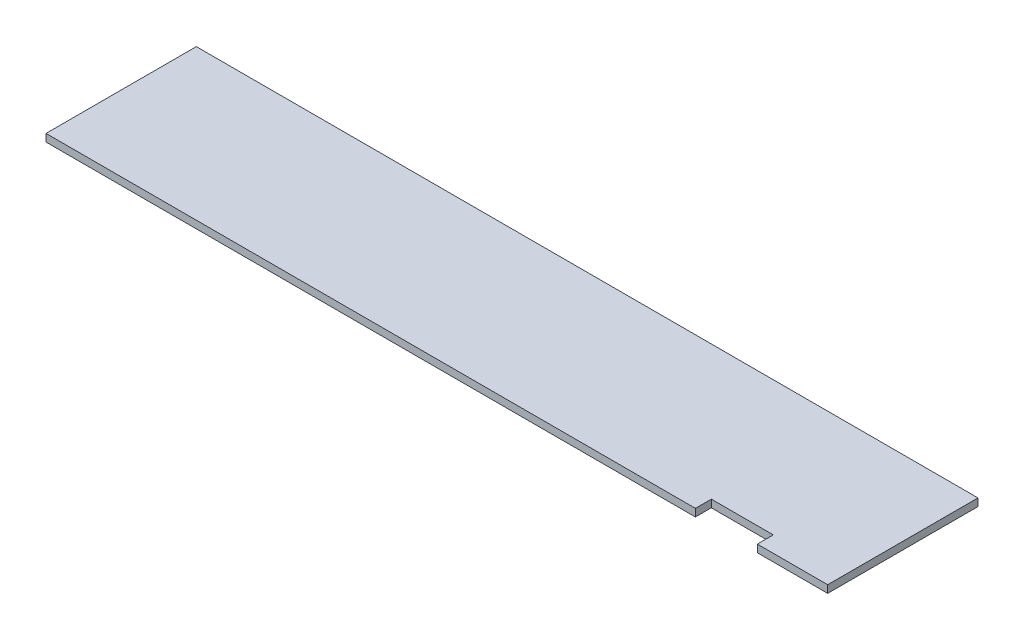
ISO-10303-21;
HEADER;
FILE_DESCRIPTION(('STEP AP214'),'2;1');
FILE_NAME('part.step','',(''),(''),'','','');
FILE_SCHEMA(('AUTOMOTIVE_DESIGN { 1 0 10303 214 1 1 1 1 }'));
ENDSEC;
DATA;
#1=APPLICATION_CONTEXT('core data for automotive mechanical design processes');
#2=APPLICATION_PROTOCOL_DEFINITION('international standard','automotive_design',2000,#1);
#3=PRODUCT_CONTEXT('',#1,'mechanical');
#4=PRODUCT('Part','Part','',(#3));
#5=PRODUCT_RELATED_PRODUCT_CATEGORY('part','',(#4));
#6=PRODUCT_DEFINITION_FORMATION('','',#4);
#7=PRODUCT_DEFINITION_CONTEXT('part definition',#1,'design');
#8=PRODUCT_DEFINITION('design','',#6,#7);
#9=PRODUCT_DEFINITION_SHAPE('','',#8);
#10=(LENGTH_UNIT() NAMED_UNIT(*) SI_UNIT(.MILLI.,.METRE.));
#11=(NAMED_UNIT(*) PLANE_ANGLE_UNIT() SI_UNIT($,.RADIAN.));
#12=(NAMED_UNIT(*) SI_UNIT($,.STERADIAN.) SOLID_ANGLE_UNIT());
#13=UNCERTAINTY_MEASURE_WITH_UNIT(LENGTH_MEASURE(1.E-05),#10,'distance_accuracy_value','');
#14=(GEOMETRIC_REPRESENTATION_CONTEXT(3) GLOBAL_UNCERTAINTY_ASSIGNED_CONTEXT((#13)) GLOBAL_UNIT_ASSIGNED_CONTEXT((#10,
#11,#12)) REPRESENTATION_CONTEXT('',''));
#15=CARTESIAN_POINT('',(0.,0.,0.));
#16=DIRECTION('',(0.,0.,1.));
#17=DIRECTION('',(1.,0.,0.));
#18=AXIS2_PLACEMENT_3D('',#15,#16,#17);
#19=CARTESIAN_POINT('',(0.,1.58749999999887,323.850000000022));
#20=DIRECTION('',(0.,0.,-1.));
#21=DIRECTION('',(0.,1.,0.));
#22=AXIS2_PLACEMENT_3D('',#19,#20,#21);
#23=PLANE('',#22);
#24=DIRECTION('',(1.,0.,0.));
#25=VECTOR('',#24,1.);
#26=CARTESIAN_POINT('',(0.,-1.58750000000113,323.850000000022));
#27=LINE('',#26,#25);
#28=CARTESIAN_POINT('',(1643.3038,-1.58750000000687,323.850000000022));
#29=VERTEX_POINT('',#28);
#30=CARTESIAN_POINT('',(1673.02180000001,-1.58750000000697,323.850000000022));
#31=VERTEX_POINT('',#30);
#32=EDGE_CURVE('E133',#29,#31,#27,.T.);
#33=ORIENTED_EDGE('',*,*,#32,.T.);
#34=DIRECTION('',(0.,-1.,0.));
#35=VECTOR('',#34,1.);
#36=CARTESIAN_POINT('',(1673.02180000001,1.58749999999303,323.850000000022));
#37=LINE('',#36,#35);
#38=CARTESIAN_POINT('',(1673.02180000001,1.58749999999303,323.850000000022));
#39=VERTEX_POINT('',#38);
#40=EDGE_CURVE('E11',#39,#31,#37,.T.);
#41=ORIENTED_EDGE('',*,*,#40,.F.);
#42=DIRECTION('',(1.,0.,0.));
#43=VECTOR('',#42,1.);
#44=CARTESIAN_POINT('',(0.,1.58749999999887,323.850000000022));
#45=LINE('',#44,#43);
#46=CARTESIAN_POINT('',(1643.3038,1.58749999999313,323.850000000022));
#47=VERTEX_POINT('',#46);
#48=EDGE_CURVE('E150',#47,#39,#45,.T.);
#49=ORIENTED_EDGE('',*,*,#48,.F.);
#50=DIRECTION('',(0.,-1.,0.));
#51=VECTOR('',#50,1.);
#52=CARTESIAN_POINT('',(1643.3038,1.58749999999313,323.850000000022));
#53=LINE('',#52,#51);
#54=EDGE_CURVE('E52',#47,#29,#53,.T.);
#55=ORIENTED_EDGE('',*,*,#54,.T.);
#56=EDGE_LOOP('',(#33,#41,#49,#55));
#57=FACE_BOUND('',#56,.T.);
#58=ADVANCED_FACE('F35',(#57),#23,.F.);
#59=CARTESIAN_POINT('',(1673.02180000001,1.58749999999416,0.));
#60=DIRECTION('',(-1.,0.,0.));
#61=DIRECTION('',(0.,-1.,0.));
#62=AXIS2_PLACEMENT_3D('',#59,#60,#61);
#63=PLANE('',#62);
#64=DIRECTION('',(0.,0.,-1.));
#65=VECTOR('',#64,1.);
#66=CARTESIAN_POINT('',(1673.02180000001,-1.58750000000584,0.));
#67=LINE('',#66,#65);
#68=CARTESIAN_POINT('',(1673.02180000001,-1.58750000000675,260.350000000022));
#69=VERTEX_POINT('',#68);
#70=EDGE_CURVE('E135',#31,#69,#67,.T.);
#71=ORIENTED_EDGE('',*,*,#70,.T.);
#72=DIRECTION('',(0.,-1.,0.));
#73=VECTOR('',#72,1.);
#74=CARTESIAN_POINT('',(1673.02180000001,1.58749999999325,260.350000000022));
#75=LINE('',#74,#73);
#76=CARTESIAN_POINT('',(1673.02180000001,1.58749999999325,260.350000000022));
#77=VERTEX_POINT('',#76);
#78=EDGE_CURVE('E44',#77,#69,#75,.T.);
#79=ORIENTED_EDGE('',*,*,#78,.F.);
#80=DIRECTION('',(0.,0.,-1.));
#81=VECTOR('',#80,1.);
#82=CARTESIAN_POINT('',(1673.02180000001,1.58749999999416,0.));
#83=LINE('',#82,#81);
#84=EDGE_CURVE('E90',#39,#77,#83,.T.);
#85=ORIENTED_EDGE('',*,*,#84,.F.);
#86=ORIENTED_EDGE('',*,*,#40,.T.);
#87=EDGE_LOOP('',(#71,#79,#85,#86));
#88=FACE_BOUND('',#87,.T.);
#89=ADVANCED_FACE('F37',(#88),#63,.F.);
#90=CARTESIAN_POINT('',(0.,1.58749999999909,260.350000000022));
#91=DIRECTION('',(0.,0.,-1.));
#92=DIRECTION('',(0.,1.,0.));
#93=AXIS2_PLACEMENT_3D('',#90,#91,#92);
#94=PLANE('',#93);
#95=DIRECTION('',(1.,0.,0.));
#96=VECTOR('',#95,1.);
#97=CARTESIAN_POINT('',(0.,-1.58750000000091,260.350000000022));
#98=LINE('',#97,#96);
#99=CARTESIAN_POINT('',(1342.82180000001,-1.5875000000056,260.350000000022));
#100=VERTEX_POINT('',#99);
#101=EDGE_CURVE('E139',#100,#69,#98,.T.);
#102=ORIENTED_EDGE('',*,*,#101,.F.);
#103=DIRECTION('',(0.,-1.,0.));
#104=VECTOR('',#103,1.);
#105=CARTESIAN_POINT('',(1342.82180000001,1.5874999999944,260.350000000022));
#106=LINE('',#105,#104);
#107=CARTESIAN_POINT('',(1342.82180000001,1.5874999999944,260.350000000022));
#108=VERTEX_POINT('',#107);
#109=EDGE_CURVE('E157',#108,#100,#106,.T.);
#110=ORIENTED_EDGE('',*,*,#109,.F.);
#111=DIRECTION('',(1.,0.,0.));
#112=VECTOR('',#111,1.);
#113=CARTESIAN_POINT('',(0.,1.58749999999909,260.350000000022));
#114=LINE('',#113,#112);
#115=EDGE_CURVE('E163',#108,#77,#114,.T.);
#116=ORIENTED_EDGE('',*,*,#115,.T.);
#117=ORIENTED_EDGE('',*,*,#78,.T.);
#118=EDGE_LOOP('',(#102,#110,#116,#117));
#119=FACE_BOUND('',#118,.T.);
#120=ADVANCED_FACE('F161',(#119),#94,.T.);
#121=CARTESIAN_POINT('',(1342.82180000001,1.58749999999531,2.81787482236952E-11));
#122=DIRECTION('',(1.,0.,0.));
#123=DIRECTION('',(0.,0.,-1.));
#124=AXIS2_PLACEMENT_3D('',#121,#122,#123);
#125=PLANE('',#124);
#126=DIRECTION('',(0.,0.,1.));
#127=VECTOR('',#126,1.);
#128=CARTESIAN_POINT('',(1342.82180000001,-1.58750000000469,2.8167645993449E-11));
#129=LINE('',#128,#127);
#130=CARTESIAN_POINT('',(1342.8218,-1.58750000000582,323.850000000022));
#131=VERTEX_POINT('',#130);
#132=EDGE_CURVE('E142',#100,#131,#129,.T.);
#133=ORIENTED_EDGE('',*,*,#132,.T.);
#134=DIRECTION('',(0.,-1.,0.));
#135=VECTOR('',#134,1.);
#136=CARTESIAN_POINT('',(1342.8218,1.58749999999418,323.850000000022));
#137=LINE('',#136,#135);
#138=CARTESIAN_POINT('',(1342.8218,1.58749999999418,323.850000000022));
#139=VERTEX_POINT('',#138);
#140=EDGE_CURVE('E154',#139,#131,#137,.T.);
#141=ORIENTED_EDGE('',*,*,#140,.F.);
#142=DIRECTION('',(0.,0.,1.));
#143=VECTOR('',#142,1.);
#144=CARTESIAN_POINT('',(1342.82180000001,1.58749999999531,2.81787482236952E-11));
#145=LINE('',#144,#143);
#146=EDGE_CURVE('E175',#108,#139,#145,.T.);
#147=ORIENTED_EDGE('',*,*,#146,.F.);
#148=ORIENTED_EDGE('',*,*,#109,.T.);
#149=EDGE_LOOP('',(#133,#141,#147,#148));
#150=FACE_BOUND('',#149,.T.);
#151=ADVANCED_FACE('F171',(#150),#125,.F.);
#152=CARTESIAN_POINT('',(1617.1418,-1.58750000000678,323.850000000022));
#153=VERTEX_POINT('',#152);
#154=EDGE_CURVE('E136',#131,#153,#27,.T.);
#155=ORIENTED_EDGE('',*,*,#154,.T.);
#156=DIRECTION('',(0.,-1.,0.));
#157=VECTOR('',#156,1.);
#158=CARTESIAN_POINT('',(1617.1418,1.58749999999322,323.850000000022));
#159=LINE('',#158,#157);
#160=CARTESIAN_POINT('',(1617.1418,1.58749999999322,323.850000000022));
#161=VERTEX_POINT('',#160);
#162=EDGE_CURVE('E125',#161,#153,#159,.T.);
#163=ORIENTED_EDGE('',*,*,#162,.F.);
#164=EDGE_CURVE('E113',#139,#161,#45,.T.);
#165=ORIENTED_EDGE('',*,*,#164,.F.);
#166=ORIENTED_EDGE('',*,*,#140,.T.);
#167=EDGE_LOOP('',(#155,#163,#165,#166));
#168=FACE_BOUND('',#167,.T.);
#169=ADVANCED_FACE('F174',(#168),#23,.F.);
#170=CARTESIAN_POINT('',(1617.1418,1.58749999999435,0.));
#171=DIRECTION('',(-1.,0.,0.));
#172=DIRECTION('',(0.,-1.,0.));
#173=AXIS2_PLACEMENT_3D('',#170,#171,#172);
#174=PLANE('',#173);
#175=DIRECTION('',(0.,0.,-1.));
#176=VECTOR('',#175,1.);
#177=CARTESIAN_POINT('',(1617.1418,-1.58750000000565,0.));
#178=LINE('',#177,#176);
#179=CARTESIAN_POINT('',(1617.1418,-1.58750000000675,317.119));
#180=VERTEX_POINT('',#179);
#181=EDGE_CURVE('E122',#153,#180,#178,.T.);
#182=ORIENTED_EDGE('',*,*,#181,.T.);
#183=DIRECTION('',(0.,-1.,0.));
#184=VECTOR('',#183,1.);
#185=CARTESIAN_POINT('',(1617.1418,1.58749999999324,317.119));
#186=LINE('',#185,#184);
#187=CARTESIAN_POINT('',(1617.1418,1.58749999999324,317.119));
#188=VERTEX_POINT('',#187);
#189=EDGE_CURVE('E119',#188,#180,#186,.T.);
#190=ORIENTED_EDGE('',*,*,#189,.F.);
#191=DIRECTION('',(0.,0.,-1.));
#192=VECTOR('',#191,1.);
#193=CARTESIAN_POINT('',(1617.1418,1.58749999999435,0.));
#194=LINE('',#193,#192);
#195=EDGE_CURVE('E106',#161,#188,#194,.T.);
#196=ORIENTED_EDGE('',*,*,#195,.F.);
#197=ORIENTED_EDGE('',*,*,#162,.T.);
#198=EDGE_LOOP('',(#182,#190,#196,#197));
#199=FACE_BOUND('',#198,.T.);
#200=ADVANCED_FACE('F120',(#199),#174,.F.);
#201=CARTESIAN_POINT('',(0.,1.58749999999889,317.119));
#202=DIRECTION('',(0.,0.,1.));
#203=DIRECTION('',(0.,-1.,0.));
#204=AXIS2_PLACEMENT_3D('',#201,#202,#203);
#205=PLANE('',#204);
#206=DIRECTION('',(-1.,0.,0.));
#207=VECTOR('',#206,1.);
#208=CARTESIAN_POINT('',(0.,-1.58750000000111,317.119));
#209=LINE('',#208,#207);
#210=CARTESIAN_POINT('',(1643.3038,-1.58750000000685,317.119));
#211=VERTEX_POINT('',#210);
#212=EDGE_CURVE('E145',#211,#180,#209,.T.);
#213=ORIENTED_EDGE('',*,*,#212,.F.);
#214=DIRECTION('',(0.,-1.,0.));
#215=VECTOR('',#214,1.);
#216=CARTESIAN_POINT('',(1643.3038,1.58749999999315,317.119));
#217=LINE('',#216,#215);
#218=CARTESIAN_POINT('',(1643.3038,1.58749999999315,317.119));
#219=VERTEX_POINT('',#218);
#220=EDGE_CURVE('E78',#219,#211,#217,.T.);
#221=ORIENTED_EDGE('',*,*,#220,.F.);
#222=DIRECTION('',(-1.,0.,0.));
#223=VECTOR('',#222,1.);
#224=CARTESIAN_POINT('',(0.,1.58749999999889,317.119));
#225=LINE('',#224,#223);
#226=EDGE_CURVE('E111',#219,#188,#225,.T.);
#227=ORIENTED_EDGE('',*,*,#226,.T.);
#228=ORIENTED_EDGE('',*,*,#189,.T.);
#229=EDGE_LOOP('',(#213,#221,#227,#228));
#230=FACE_BOUND('',#229,.T.);
#231=ADVANCED_FACE('F127',(#230),#205,.T.);
#232=CARTESIAN_POINT('',(1643.3038,1.58749999999426,0.));
#233=DIRECTION('',(-1.,0.,0.));
#234=DIRECTION('',(0.,-1.,0.));
#235=AXIS2_PLACEMENT_3D('',#232,#233,#234);
#236=PLANE('',#235);
#237=DIRECTION('',(0.,0.,-1.));
#238=VECTOR('',#237,1.);
#239=CARTESIAN_POINT('',(1643.3038,-1.58750000000574,0.));
#240=LINE('',#239,#238);
#241=EDGE_CURVE('E147',#29,#211,#240,.T.);
#242=ORIENTED_EDGE('',*,*,#241,.F.);
#243=ORIENTED_EDGE('',*,*,#54,.F.);
#244=DIRECTION('',(0.,0.,-1.));
#245=VECTOR('',#244,1.);
#246=CARTESIAN_POINT('',(1643.3038,1.58749999999426,0.));
#247=LINE('',#246,#245);
#248=EDGE_CURVE('E128',#47,#219,#247,.T.);
#249=ORIENTED_EDGE('',*,*,#248,.T.);
#250=ORIENTED_EDGE('',*,*,#220,.T.);
#251=EDGE_LOOP('',(#242,#243,#249,#250));
#252=FACE_BOUND('',#251,.T.);
#253=ADVANCED_FACE('F179',(#252),#236,.T.);
#254=CARTESIAN_POINT('',(0.,1.5875,0.));
#255=DIRECTION('',(0.,1.,0.));
#256=DIRECTION('',(0.,0.,1.));
#257=AXIS2_PLACEMENT_3D('',#254,#255,#256);
#258=PLANE('',#257);
#259=ORIENTED_EDGE('',*,*,#48,.T.);
#260=ORIENTED_EDGE('',*,*,#84,.T.);
#261=ORIENTED_EDGE('',*,*,#115,.F.);
#262=ORIENTED_EDGE('',*,*,#146,.T.);
#263=ORIENTED_EDGE('',*,*,#164,.T.);
#264=ORIENTED_EDGE('',*,*,#195,.T.);
#265=ORIENTED_EDGE('',*,*,#226,.F.);
#266=ORIENTED_EDGE('',*,*,#248,.F.);
#267=EDGE_LOOP('',(#259,#260,#261,#262,#263,#264,#265,#266));
#268=FACE_BOUND('',#267,.T.);
#269=ADVANCED_FACE('F108',(#268),#258,.T.);
#270=CARTESIAN_POINT('',(0.,-1.5875,0.));
#271=DIRECTION('',(0.,1.,0.));
#272=DIRECTION('',(0.,0.,1.));
#273=AXIS2_PLACEMENT_3D('',#270,#271,#272);
#274=PLANE('',#273);
#275=ORIENTED_EDGE('',*,*,#32,.F.);
#276=ORIENTED_EDGE('',*,*,#241,.T.);
#277=ORIENTED_EDGE('',*,*,#212,.T.);
#278=ORIENTED_EDGE('',*,*,#181,.F.);
#279=ORIENTED_EDGE('',*,*,#154,.F.);
#280=ORIENTED_EDGE('',*,*,#132,.F.);
#281=ORIENTED_EDGE('',*,*,#101,.T.);
#282=ORIENTED_EDGE('',*,*,#70,.F.);
#283=EDGE_LOOP('',(#275,#276,#277,#278,#279,#280,#281,#282));
#284=FACE_BOUND('',#283,.T.);
#285=ADVANCED_FACE('F167',(#284),#274,.F.);
#286=CLOSED_SHELL('',(#58,#89,#120,#151,#169,#200,#231,#253,#269,#285));
#287=MANIFOLD_SOLID_BREP('B2',#286);
#288=ADVANCED_BREP_SHAPE_REPRESENTATION('',(#18,#287),#14);
#289=SHAPE_DEFINITION_REPRESENTATION(#9,#288);
ENDSEC;
END-ISO-10303-21;
